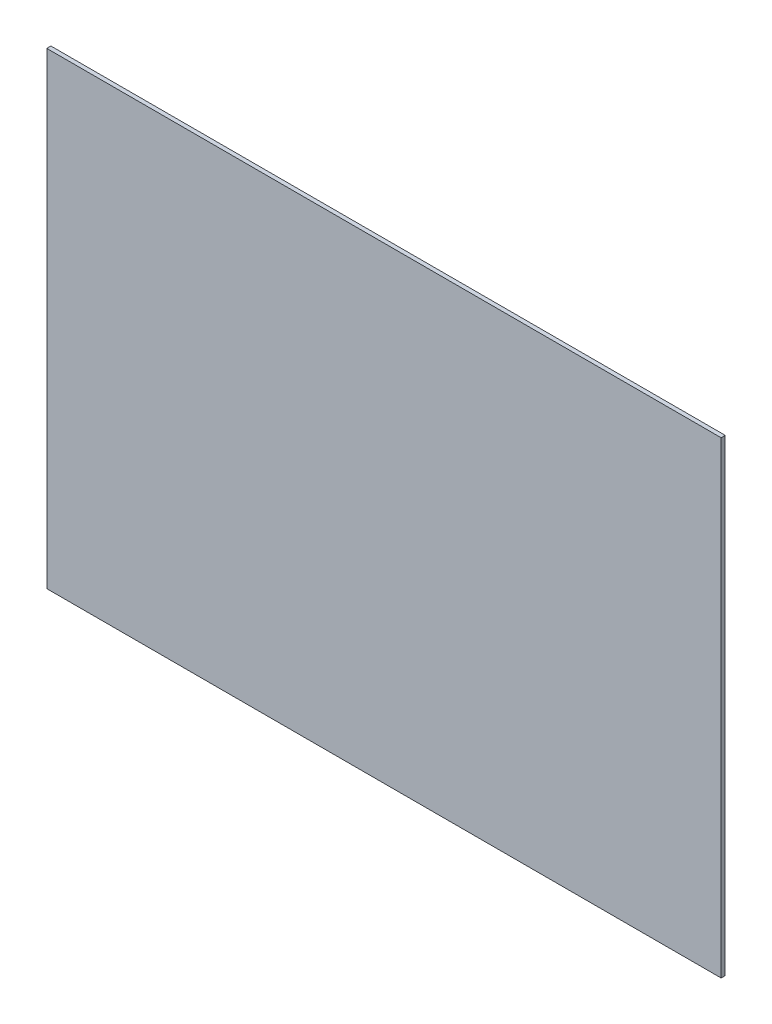
ISO-10303-21;
HEADER;
FILE_DESCRIPTION(('STEP AP214'),'2;1');
FILE_NAME('part.step','',(''),(''),'','','');
FILE_SCHEMA(('AUTOMOTIVE_DESIGN { 1 0 10303 214 1 1 1 1 }'));
ENDSEC;
DATA;
#1=APPLICATION_CONTEXT('core data for automotive mechanical design processes');
#2=APPLICATION_PROTOCOL_DEFINITION('international standard','automotive_design',2000,#1);
#3=PRODUCT_CONTEXT('',#1,'mechanical');
#4=PRODUCT('Part','Part','',(#3));
#5=PRODUCT_RELATED_PRODUCT_CATEGORY('part','',(#4));
#6=PRODUCT_DEFINITION_FORMATION('','',#4);
#7=PRODUCT_DEFINITION_CONTEXT('part definition',#1,'design');
#8=PRODUCT_DEFINITION('design','',#6,#7);
#9=PRODUCT_DEFINITION_SHAPE('','',#8);
#10=(LENGTH_UNIT() NAMED_UNIT(*) SI_UNIT(.MILLI.,.METRE.));
#11=(NAMED_UNIT(*) PLANE_ANGLE_UNIT() SI_UNIT($,.RADIAN.));
#12=(NAMED_UNIT(*) SI_UNIT($,.STERADIAN.) SOLID_ANGLE_UNIT());
#13=UNCERTAINTY_MEASURE_WITH_UNIT(LENGTH_MEASURE(1.E-05),#10,'distance_accuracy_value','');
#14=(GEOMETRIC_REPRESENTATION_CONTEXT(3) GLOBAL_UNCERTAINTY_ASSIGNED_CONTEXT((#13)) GLOBAL_UNIT_ASSIGNED_CONTEXT((#10,
#11,#12)) REPRESENTATION_CONTEXT('',''));
#15=CARTESIAN_POINT('',(0.,0.,0.));
#16=DIRECTION('',(0.,0.,1.));
#17=DIRECTION('',(1.,0.,0.));
#18=AXIS2_PLACEMENT_3D('',#15,#16,#17);
#19=CARTESIAN_POINT('',(-32.0765714285714,7.78357142857143,-0.3));
#20=DIRECTION('',(-1.,0.,0.));
#21=DIRECTION('',(0.,0.,1.));
#22=AXIS2_PLACEMENT_3D('',#19,#20,#21);
#23=PLANE('',#22);
#24=DIRECTION('',(0.,-1.,0.));
#25=VECTOR('',#24,1.);
#26=CARTESIAN_POINT('',(-32.0765714285714,7.78357142857143,0.));
#27=LINE('',#26,#25);
#28=CARTESIAN_POINT('',(-32.0765714285714,7.78357142857143,0.));
#29=VERTEX_POINT('',#28);
#30=CARTESIAN_POINT('',(-32.0765714285714,-26.2164285714286,0.));
#31=VERTEX_POINT('',#30);
#32=EDGE_CURVE('E75',#29,#31,#27,.T.);
#33=ORIENTED_EDGE('',*,*,#32,.F.);
#34=DIRECTION('',(0.,0.,1.));
#35=VECTOR('',#34,1.);
#36=CARTESIAN_POINT('',(-32.0765714285714,7.78357142857143,-0.3));
#37=LINE('',#36,#35);
#38=CARTESIAN_POINT('',(-32.0765714285714,7.78357142857143,-0.3));
#39=VERTEX_POINT('',#38);
#40=EDGE_CURVE('E11',#39,#29,#37,.T.);
#41=ORIENTED_EDGE('',*,*,#40,.F.);
#42=DIRECTION('',(0.,-1.,0.));
#43=VECTOR('',#42,1.);
#44=CARTESIAN_POINT('',(-32.0765714285714,7.78357142857143,-0.3));
#45=LINE('',#44,#43);
#46=CARTESIAN_POINT('',(-32.0765714285714,-26.2164285714286,-0.3));
#47=VERTEX_POINT('',#46);
#48=EDGE_CURVE('E77',#39,#47,#45,.T.);
#49=ORIENTED_EDGE('',*,*,#48,.T.);
#50=DIRECTION('',(0.,0.,1.));
#51=VECTOR('',#50,1.);
#52=CARTESIAN_POINT('',(-32.0765714285714,-26.2164285714286,-0.3));
#53=LINE('',#52,#51);
#54=EDGE_CURVE('E38',#47,#31,#53,.T.);
#55=ORIENTED_EDGE('',*,*,#54,.T.);
#56=EDGE_LOOP('',(#33,#41,#49,#55));
#57=FACE_BOUND('',#56,.T.);
#58=ADVANCED_FACE('F35',(#57),#23,.T.);
#59=CARTESIAN_POINT('',(-32.0765714285714,7.78357142857143,-0.3));
#60=DIRECTION('',(0.,1.,0.));
#61=DIRECTION('',(0.,0.,1.));
#62=AXIS2_PLACEMENT_3D('',#59,#60,#61);
#63=PLANE('',#62);
#64=DIRECTION('',(-1.,0.,0.));
#65=VECTOR('',#64,1.);
#66=CARTESIAN_POINT('',(-32.0765714285714,7.78357142857143,0.));
#67=LINE('',#66,#65);
#68=CARTESIAN_POINT('',(16.9234285714286,7.78357142857143,0.));
#69=VERTEX_POINT('',#68);
#70=EDGE_CURVE('E92',#69,#29,#67,.T.);
#71=ORIENTED_EDGE('',*,*,#70,.F.);
#72=DIRECTION('',(0.,0.,1.));
#73=VECTOR('',#72,1.);
#74=CARTESIAN_POINT('',(16.9234285714286,7.78357142857143,-0.3));
#75=LINE('',#74,#73);
#76=CARTESIAN_POINT('',(16.9234285714286,7.78357142857143,-0.3));
#77=VERTEX_POINT('',#76);
#78=EDGE_CURVE('E43',#77,#69,#75,.T.);
#79=ORIENTED_EDGE('',*,*,#78,.F.);
#80=DIRECTION('',(-1.,0.,0.));
#81=VECTOR('',#80,1.);
#82=CARTESIAN_POINT('',(-32.0765714285714,7.78357142857143,-0.3));
#83=LINE('',#82,#81);
#84=EDGE_CURVE('E82',#77,#39,#83,.T.);
#85=ORIENTED_EDGE('',*,*,#84,.T.);
#86=ORIENTED_EDGE('',*,*,#40,.T.);
#87=EDGE_LOOP('',(#71,#79,#85,#86));
#88=FACE_BOUND('',#87,.T.);
#89=ADVANCED_FACE('F107',(#88),#63,.T.);
#90=CARTESIAN_POINT('',(16.9234285714286,7.78357142857143,-0.3));
#91=DIRECTION('',(1.,0.,0.));
#92=DIRECTION('',(0.,1.,0.));
#93=AXIS2_PLACEMENT_3D('',#90,#91,#92);
#94=PLANE('',#93);
#95=DIRECTION('',(0.,1.,0.));
#96=VECTOR('',#95,1.);
#97=CARTESIAN_POINT('',(16.9234285714286,7.78357142857143,0.));
#98=LINE('',#97,#96);
#99=CARTESIAN_POINT('',(16.9234285714286,-26.2164285714286,0.));
#100=VERTEX_POINT('',#99);
#101=EDGE_CURVE('E89',#100,#69,#98,.T.);
#102=ORIENTED_EDGE('',*,*,#101,.F.);
#103=DIRECTION('',(0.,0.,1.));
#104=VECTOR('',#103,1.);
#105=CARTESIAN_POINT('',(16.9234285714286,-26.2164285714286,-0.3));
#106=LINE('',#105,#104);
#107=CARTESIAN_POINT('',(16.9234285714286,-26.2164285714286,-0.3));
#108=VERTEX_POINT('',#107);
#109=EDGE_CURVE('E81',#108,#100,#106,.T.);
#110=ORIENTED_EDGE('',*,*,#109,.F.);
#111=DIRECTION('',(0.,1.,0.));
#112=VECTOR('',#111,1.);
#113=CARTESIAN_POINT('',(16.9234285714286,7.78357142857143,-0.3));
#114=LINE('',#113,#112);
#115=EDGE_CURVE('E100',#108,#77,#114,.T.);
#116=ORIENTED_EDGE('',*,*,#115,.T.);
#117=ORIENTED_EDGE('',*,*,#78,.T.);
#118=EDGE_LOOP('',(#102,#110,#116,#117));
#119=FACE_BOUND('',#118,.T.);
#120=ADVANCED_FACE('F104',(#119),#94,.T.);
#121=CARTESIAN_POINT('',(-32.0765714285714,-26.2164285714286,-0.3));
#122=DIRECTION('',(0.,-1.,0.));
#123=DIRECTION('',(0.,0.,-1.));
#124=AXIS2_PLACEMENT_3D('',#121,#122,#123);
#125=PLANE('',#124);
#126=DIRECTION('',(1.,0.,0.));
#127=VECTOR('',#126,1.);
#128=CARTESIAN_POINT('',(-32.0765714285714,-26.2164285714286,0.));
#129=LINE('',#128,#127);
#130=EDGE_CURVE('E84',#31,#100,#129,.T.);
#131=ORIENTED_EDGE('',*,*,#130,.F.);
#132=ORIENTED_EDGE('',*,*,#54,.F.);
#133=DIRECTION('',(1.,0.,0.));
#134=VECTOR('',#133,1.);
#135=CARTESIAN_POINT('',(-32.0765714285714,-26.2164285714286,-0.3));
#136=LINE('',#135,#134);
#137=EDGE_CURVE('E98',#47,#108,#136,.T.);
#138=ORIENTED_EDGE('',*,*,#137,.T.);
#139=ORIENTED_EDGE('',*,*,#109,.T.);
#140=EDGE_LOOP('',(#131,#132,#138,#139));
#141=FACE_BOUND('',#140,.T.);
#142=ADVANCED_FACE('F85',(#141),#125,.T.);
#143=CARTESIAN_POINT('',(-32.0765714285714,-26.2164285714286,-0.3));
#144=DIRECTION('',(0.,0.,1.));
#145=DIRECTION('',(1.,0.,0.));
#146=AXIS2_PLACEMENT_3D('',#143,#144,#145);
#147=PLANE('',#146);
#148=ORIENTED_EDGE('',*,*,#48,.F.);
#149=ORIENTED_EDGE('',*,*,#84,.F.);
#150=ORIENTED_EDGE('',*,*,#115,.F.);
#151=ORIENTED_EDGE('',*,*,#137,.F.);
#152=EDGE_LOOP('',(#148,#149,#150,#151));
#153=FACE_BOUND('',#152,.T.);
#154=ADVANCED_FACE('F109',(#153),#147,.F.);
#155=CARTESIAN_POINT('',(-32.0765714285714,-26.2164285714286,0.));
#156=DIRECTION('',(0.,0.,1.));
#157=DIRECTION('',(1.,0.,0.));
#158=AXIS2_PLACEMENT_3D('',#155,#156,#157);
#159=PLANE('',#158);
#160=ORIENTED_EDGE('',*,*,#32,.T.);
#161=ORIENTED_EDGE('',*,*,#130,.T.);
#162=ORIENTED_EDGE('',*,*,#101,.T.);
#163=ORIENTED_EDGE('',*,*,#70,.T.);
#164=EDGE_LOOP('',(#160,#161,#162,#163));
#165=FACE_BOUND('',#164,.T.);
#166=ADVANCED_FACE('F91',(#165),#159,.T.);
#167=CLOSED_SHELL('',(#58,#89,#120,#142,#154,#166));
#168=MANIFOLD_SOLID_BREP('B2',#167);
#169=ADVANCED_BREP_SHAPE_REPRESENTATION('',(#18,#168),#14);
#170=SHAPE_DEFINITION_REPRESENTATION(#9,#169);
ENDSEC;
END-ISO-10303-21;
